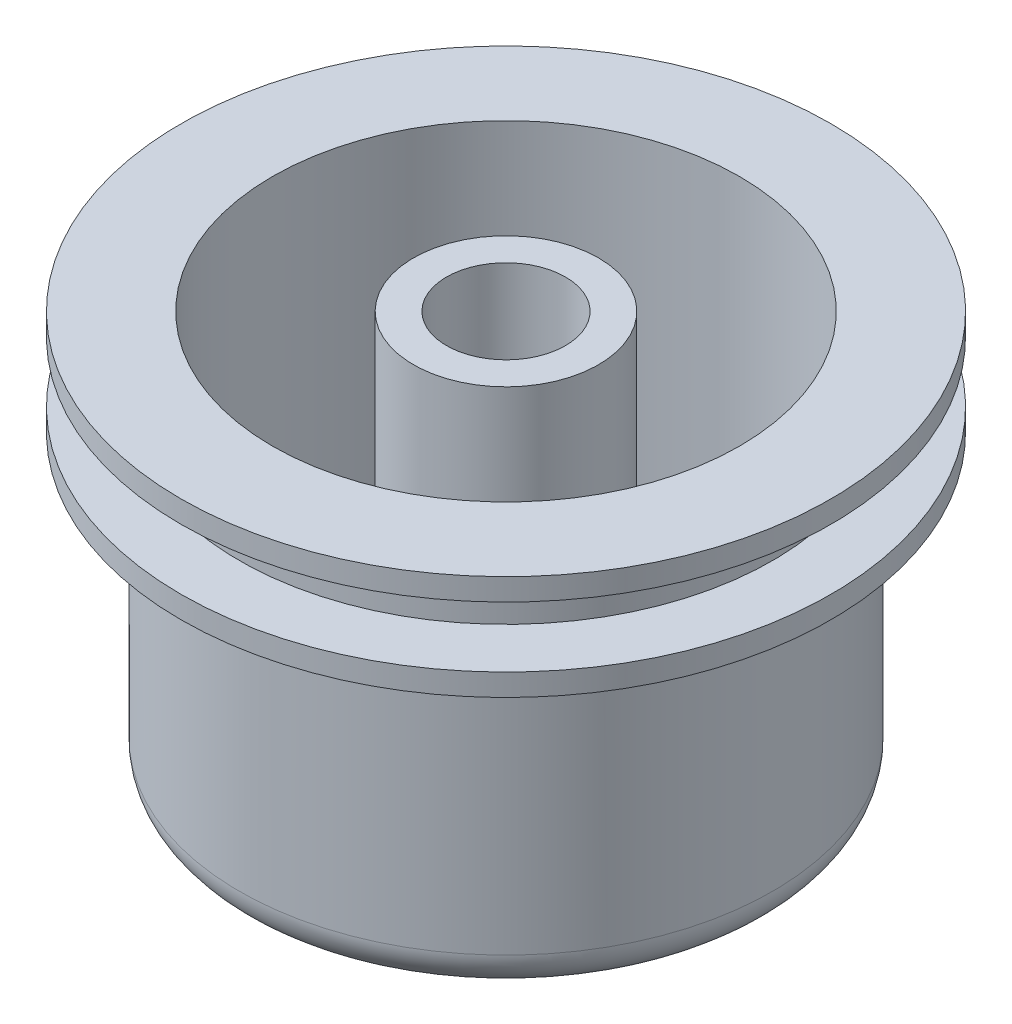
ISO-10303-21;
HEADER;
FILE_DESCRIPTION(('STEP AP214'),'2;1');
FILE_NAME('part.step','',(''),(''),'','','');
FILE_SCHEMA(('AUTOMOTIVE_DESIGN { 1 0 10303 214 1 1 1 1 }'));
ENDSEC;
DATA;
#1=APPLICATION_CONTEXT('core data for automotive mechanical design processes');
#2=APPLICATION_PROTOCOL_DEFINITION('international standard','automotive_design',2000,#1);
#3=PRODUCT_CONTEXT('',#1,'mechanical');
#4=PRODUCT('Part','Part','',(#3));
#5=PRODUCT_RELATED_PRODUCT_CATEGORY('part','',(#4));
#6=PRODUCT_DEFINITION_FORMATION('','',#4);
#7=PRODUCT_DEFINITION_CONTEXT('part definition',#1,'design');
#8=PRODUCT_DEFINITION('design','',#6,#7);
#9=PRODUCT_DEFINITION_SHAPE('','',#8);
#10=(LENGTH_UNIT() NAMED_UNIT(*) SI_UNIT(.MILLI.,.METRE.));
#11=(NAMED_UNIT(*) PLANE_ANGLE_UNIT() SI_UNIT($,.RADIAN.));
#12=(NAMED_UNIT(*) SI_UNIT($,.STERADIAN.) SOLID_ANGLE_UNIT());
#13=UNCERTAINTY_MEASURE_WITH_UNIT(LENGTH_MEASURE(1.E-05),#10,'distance_accuracy_value','');
#14=(GEOMETRIC_REPRESENTATION_CONTEXT(3) GLOBAL_UNCERTAINTY_ASSIGNED_CONTEXT((#13)) GLOBAL_UNIT_ASSIGNED_CONTEXT((#10,
#11,#12)) REPRESENTATION_CONTEXT('',''));
#15=CARTESIAN_POINT('',(0.,0.,0.));
#16=DIRECTION('',(0.,0.,1.));
#17=DIRECTION('',(1.,0.,0.));
#18=AXIS2_PLACEMENT_3D('',#15,#16,#17);
#19=CARTESIAN_POINT('',(0.,19.05508,0.));
#20=DIRECTION('',(0.,-1.,0.));
#21=DIRECTION('',(0.,0.,-1.));
#22=AXIS2_PLACEMENT_3D('',#19,#20,#21);
#23=CYLINDRICAL_SURFACE('',#22,2.7432);
#24=CARTESIAN_POINT('',(0.,18.796,0.));
#25=DIRECTION('',(0.,-1.,0.));
#26=DIRECTION('',(0.,0.,-1.));
#27=AXIS2_PLACEMENT_3D('',#24,#25,#26);
#28=CIRCLE('',#27,2.7432);
#29=CARTESIAN_POINT('',(0.,18.796,-2.7432));
#30=VERTEX_POINT('',#29);
#31=EDGE_CURVE('E231',#30,#30,#28,.T.);
#32=ORIENTED_EDGE('',*,*,#31,.F.);
#33=EDGE_LOOP('',(#32));
#34=FACE_BOUND('',#33,.T.);
#35=CARTESIAN_POINT('',(0.,5.84200000000041,0.));
#36=DIRECTION('',(0.,-1.,0.));
#37=DIRECTION('',(0.,0.,-1.));
#38=AXIS2_PLACEMENT_3D('',#35,#36,#37);
#39=CIRCLE('',#38,2.7432);
#40=CARTESIAN_POINT('',(0.,5.84200000000041,-2.7432));
#41=VERTEX_POINT('',#40);
#42=EDGE_CURVE('E237',#41,#41,#39,.T.);
#43=ORIENTED_EDGE('',*,*,#42,.T.);
#44=EDGE_LOOP('',(#43));
#45=FACE_BOUND('',#44,.T.);
#46=ADVANCED_FACE('F17',(#34,#45),#23,.F.);
#47=CARTESIAN_POINT('',(0.,13.97,0.));
#48=DIRECTION('',(0.,1.,0.));
#49=DIRECTION('',(0.,0.,1.));
#50=AXIS2_PLACEMENT_3D('',#47,#48,#49);
#51=PLANE('',#50);
#52=CARTESIAN_POINT('',(0.,13.97,0.));
#53=DIRECTION('',(0.,-1.,0.));
#54=DIRECTION('',(0.,0.,-1.));
#55=AXIS2_PLACEMENT_3D('',#52,#53,#54);
#56=CIRCLE('',#55,12.2936);
#57=CARTESIAN_POINT('',(0.,13.97,-12.2936));
#58=VERTEX_POINT('',#57);
#59=EDGE_CURVE('E228',#58,#58,#56,.T.);
#60=ORIENTED_EDGE('',*,*,#59,.F.);
#61=EDGE_LOOP('',(#60));
#62=FACE_BOUND('',#61,.T.);
#63=CARTESIAN_POINT('',(0.,13.9700000000011,0.));
#64=DIRECTION('',(0.,1.,0.));
#65=DIRECTION('',(0.,0.,1.));
#66=AXIS2_PLACEMENT_3D('',#63,#64,#65);
#67=CIRCLE('',#66,14.986);
#68=CARTESIAN_POINT('',(0.,13.9700000000011,14.986));
#69=VERTEX_POINT('',#68);
#70=EDGE_CURVE('E234',#69,#69,#67,.T.);
#71=ORIENTED_EDGE('',*,*,#70,.F.);
#72=EDGE_LOOP('',(#71));
#73=FACE_BOUND('',#72,.T.);
#74=ADVANCED_FACE('F114',(#62,#73),#51,.F.);
#75=CARTESIAN_POINT('',(0.,5.842,0.));
#76=DIRECTION('',(0.,1.,0.));
#77=DIRECTION('',(0.,0.,1.));
#78=AXIS2_PLACEMENT_3D('',#75,#76,#77);
#79=PLANE('',#78);
#80=ORIENTED_EDGE('',*,*,#42,.F.);
#81=EDGE_LOOP('',(#80));
#82=FACE_BOUND('',#81,.T.);
#83=CARTESIAN_POINT('',(0.,5.842,0.));
#84=DIRECTION('',(0.,-1.,0.));
#85=DIRECTION('',(0.,0.,-1.));
#86=AXIS2_PLACEMENT_3D('',#83,#84,#85);
#87=CIRCLE('',#86,4.1656);
#88=CARTESIAN_POINT('',(0.,5.842,-4.1656));
#89=VERTEX_POINT('',#88);
#90=EDGE_CURVE('E225',#89,#89,#87,.T.);
#91=ORIENTED_EDGE('',*,*,#90,.T.);
#92=EDGE_LOOP('',(#91));
#93=FACE_BOUND('',#92,.T.);
#94=ADVANCED_FACE('F111',(#82,#93),#79,.F.);
#95=CARTESIAN_POINT('',(0.,13.9143431629979,0.));
#96=DIRECTION('',(0.,1.,0.));
#97=DIRECTION('',(0.,0.,1.));
#98=AXIS2_PLACEMENT_3D('',#95,#96,#97);
#99=CYLINDRICAL_SURFACE('',#98,14.986);
#100=ORIENTED_EDGE('',*,*,#70,.T.);
#101=EDGE_LOOP('',(#100));
#102=FACE_BOUND('',#101,.T.);
#103=CARTESIAN_POINT('',(0.,14.9859999999989,0.));
#104=DIRECTION('',(0.,1.,0.));
#105=DIRECTION('',(0.,0.,1.));
#106=AXIS2_PLACEMENT_3D('',#103,#104,#105);
#107=CIRCLE('',#106,14.986);
#108=CARTESIAN_POINT('',(0.,14.9859999999989,14.986));
#109=VERTEX_POINT('',#108);
#110=EDGE_CURVE('E222',#109,#109,#107,.T.);
#111=ORIENTED_EDGE('',*,*,#110,.F.);
#112=EDGE_LOOP('',(#111));
#113=FACE_BOUND('',#112,.T.);
#114=ADVANCED_FACE('F107',(#102,#113),#99,.T.);
#115=CARTESIAN_POINT('',(0.,18.796,0.));
#116=DIRECTION('',(0.,1.,0.));
#117=DIRECTION('',(0.,0.,1.));
#118=AXIS2_PLACEMENT_3D('',#115,#116,#117);
#119=PLANE('',#118);
#120=ORIENTED_EDGE('',*,*,#31,.T.);
#121=EDGE_LOOP('',(#120));
#122=FACE_BOUND('',#121,.T.);
#123=CARTESIAN_POINT('',(0.,18.796,0.));
#124=DIRECTION('',(0.,-1.,0.));
#125=DIRECTION('',(0.,0.,-1.));
#126=AXIS2_PLACEMENT_3D('',#123,#124,#125);
#127=CIRCLE('',#126,4.2672);
#128=CARTESIAN_POINT('',(0.,18.796,-4.2672));
#129=VERTEX_POINT('',#128);
#130=EDGE_CURVE('E218',#129,#129,#127,.T.);
#131=ORIENTED_EDGE('',*,*,#130,.F.);
#132=EDGE_LOOP('',(#131));
#133=FACE_BOUND('',#132,.T.);
#134=ADVANCED_FACE('F103',(#122,#133),#119,.T.);
#135=CARTESIAN_POINT('',(0.,18.10004,0.));
#136=DIRECTION('',(0.,-1.,0.));
#137=DIRECTION('',(0.,0.,-1.));
#138=AXIS2_PLACEMENT_3D('',#135,#136,#137);
#139=CYLINDRICAL_SURFACE('',#138,12.2936);
#140=CARTESIAN_POINT('',(0.,1.778,0.));
#141=DIRECTION('',(0.,-1.,0.));
#142=DIRECTION('',(-1.,0.,0.));
#143=AXIS2_PLACEMENT_3D('',#140,#141,#142);
#144=CIRCLE('',#143,12.2936000000021);
#145=CARTESIAN_POINT('',(-12.2936000000021,1.778,0.));
#146=VERTEX_POINT('',#145);
#147=EDGE_CURVE('E221',#146,#146,#144,.T.);
#148=ORIENTED_EDGE('',*,*,#147,.F.);
#149=EDGE_LOOP('',(#148));
#150=FACE_BOUND('',#149,.T.);
#151=ORIENTED_EDGE('',*,*,#59,.T.);
#152=EDGE_LOOP('',(#151));
#153=FACE_BOUND('',#152,.T.);
#154=ADVANCED_FACE('F99',(#150,#153),#139,.T.);
#155=CARTESIAN_POINT('',(0.,5.94614,0.));
#156=DIRECTION('',(0.,-1.,0.));
#157=DIRECTION('',(0.,0.,-1.));
#158=AXIS2_PLACEMENT_3D('',#155,#156,#157);
#159=CYLINDRICAL_SURFACE('',#158,4.1656);
#160=ORIENTED_EDGE('',*,*,#90,.F.);
#161=EDGE_LOOP('',(#160));
#162=FACE_BOUND('',#161,.T.);
#163=CARTESIAN_POINT('',(0.,0.635,0.));
#164=DIRECTION('',(0.,-1.,0.));
#165=DIRECTION('',(-0.999785221174219,0.,-0.0207246597467384));
#166=AXIS2_PLACEMENT_3D('',#163,#164,#165);
#167=CIRCLE('',#166,4.16559999999915);
#168=CARTESIAN_POINT('',(-4.16470531732248,0.635,-0.0863306426409961));
#169=VERTEX_POINT('',#168);
#170=EDGE_CURVE('E71',#169,#169,#167,.F.);
#171=ORIENTED_EDGE('',*,*,#170,.F.);
#172=EDGE_LOOP('',(#171));
#173=FACE_BOUND('',#172,.T.);
#174=ADVANCED_FACE('F95',(#162,#173),#159,.F.);
#175=CARTESIAN_POINT('',(0.,14.986,0.));
#176=DIRECTION('',(0.,1.,0.));
#177=DIRECTION('',(0.,0.,1.));
#178=AXIS2_PLACEMENT_3D('',#175,#176,#177);
#179=PLANE('',#178);
#180=CARTESIAN_POINT('',(0.,14.9860000000006,0.));
#181=DIRECTION('',(0.,-1.,0.));
#182=DIRECTION('',(0.,0.,-1.));
#183=AXIS2_PLACEMENT_3D('',#180,#181,#182);
#184=CIRCLE('',#183,12.2936);
#185=CARTESIAN_POINT('',(0.,14.9860000000006,-12.2936));
#186=VERTEX_POINT('',#185);
#187=EDGE_CURVE('E215',#186,#186,#184,.F.);
#188=ORIENTED_EDGE('',*,*,#187,.F.);
#189=EDGE_LOOP('',(#188));
#190=FACE_BOUND('',#189,.T.);
#191=ORIENTED_EDGE('',*,*,#110,.T.);
#192=EDGE_LOOP('',(#191));
#193=FACE_BOUND('',#192,.T.);
#194=ADVANCED_FACE('F91',(#190,#193),#179,.T.);
#195=CARTESIAN_POINT('',(0.,19.0246,0.));
#196=DIRECTION('',(0.,-1.,0.));
#197=DIRECTION('',(0.,0.,-1.));
#198=AXIS2_PLACEMENT_3D('',#195,#196,#197);
#199=CYLINDRICAL_SURFACE('',#198,4.2672);
#200=CARTESIAN_POINT('',(0.,7.36600000000037,0.));
#201=DIRECTION('',(0.,-1.,0.));
#202=DIRECTION('',(0.,0.,-1.));
#203=AXIS2_PLACEMENT_3D('',#200,#201,#202);
#204=CIRCLE('',#203,4.2672);
#205=CARTESIAN_POINT('',(0.,7.36600000000037,-4.2672));
#206=VERTEX_POINT('',#205);
#207=EDGE_CURVE('E58',#206,#206,#204,.T.);
#208=ORIENTED_EDGE('',*,*,#207,.F.);
#209=EDGE_LOOP('',(#208));
#210=FACE_BOUND('',#209,.T.);
#211=ORIENTED_EDGE('',*,*,#130,.T.);
#212=EDGE_LOOP('',(#211));
#213=FACE_BOUND('',#212,.T.);
#214=ADVANCED_FACE('F83',(#210,#213),#199,.T.);
#215=CARTESIAN_POINT('',(0.,1.778,0.));
#216=DIRECTION('',(0.,-1.,0.));
#217=DIRECTION('',(-1.,0.,0.));
#218=AXIS2_PLACEMENT_3D('',#215,#216,#217);
#219=TOROIDAL_SURFACE('',#218,10.515600000002,1.77800000000011);
#220=ORIENTED_EDGE('',*,*,#147,.T.);
#221=EDGE_LOOP('',(#220));
#222=FACE_BOUND('',#221,.T.);
#223=CARTESIAN_POINT('',(0.,-1.11022302462516E-13,0.));
#224=DIRECTION('',(0.,1.,0.));
#225=DIRECTION('',(1.,0.,-2.05735768840494E-13));
#226=AXIS2_PLACEMENT_3D('',#223,#224,#225);
#227=CIRCLE('',#226,10.5156000000018);
#228=CARTESIAN_POINT('',(10.5156000000011,0.,-1.29806100497327E-12));
#229=VERTEX_POINT('',#228);
#230=CARTESIAN_POINT('',(-10.5156000000011,0.,0.));
#231=VERTEX_POINT('',#230);
#232=EDGE_CURVE('E51',#229,#231,#227,.T.);
#233=ORIENTED_EDGE('',*,*,#232,.T.);
#234=CARTESIAN_POINT('',(0.,-1.11022302462516E-13,0.));
#235=DIRECTION('',(0.,1.,0.));
#236=DIRECTION('',(-1.,0.,0.));
#237=AXIS2_PLACEMENT_3D('',#234,#235,#236);
#238=CIRCLE('',#237,10.5156000000018);
#239=EDGE_CURVE('E54',#231,#229,#238,.T.);
#240=ORIENTED_EDGE('',*,*,#239,.T.);
#241=EDGE_LOOP('',(#233,#240));
#242=FACE_BOUND('',#241,.T.);
#243=ADVANCED_FACE('F62',(#222,#242),#219,.T.);
#244=CARTESIAN_POINT('',(0.,0.635,0.));
#245=DIRECTION('',(0.,-1.,0.));
#246=DIRECTION('',(-0.999785221174219,0.,-0.0207246597467384));
#247=AXIS2_PLACEMENT_3D('',#244,#245,#246);
#248=TOROIDAL_SURFACE('',#247,4.80059999999913,0.63499999999998);
#249=ORIENTED_EDGE('',*,*,#170,.T.);
#250=EDGE_LOOP('',(#249));
#251=FACE_BOUND('',#250,.T.);
#252=CARTESIAN_POINT('',(0.,0.,0.));
#253=DIRECTION('',(0.,-1.,0.));
#254=DIRECTION('',(1.,0.,3.93759775316085E-11));
#255=AXIS2_PLACEMENT_3D('',#252,#253,#254);
#256=CIRCLE('',#255,4.8005999999984);
#257=CARTESIAN_POINT('',(4.80059999999904,0.,7.68808682081261E-11));
#258=VERTEX_POINT('',#257);
#259=CARTESIAN_POINT('',(-4.80059999999904,0.,-4.03447647468953E-11));
#260=VERTEX_POINT('',#259);
#261=EDGE_CURVE('E212',#258,#260,#256,.T.);
#262=ORIENTED_EDGE('',*,*,#261,.T.);
#263=CARTESIAN_POINT('',(0.,0.,0.));
#264=DIRECTION('',(0.,-1.,0.));
#265=DIRECTION('',(-1.,0.,0.));
#266=AXIS2_PLACEMENT_3D('',#263,#264,#265);
#267=CIRCLE('',#266,4.8006);
#268=EDGE_CURVE('E63',#260,#258,#267,.T.);
#269=ORIENTED_EDGE('',*,*,#268,.T.);
#270=EDGE_LOOP('',(#262,#269));
#271=FACE_BOUND('',#270,.T.);
#272=ADVANCED_FACE('F82',(#251,#271),#248,.T.);
#273=CARTESIAN_POINT('',(0.,18.10004,0.));
#274=DIRECTION('',(0.,-1.,0.));
#275=DIRECTION('',(0.,0.,-1.));
#276=AXIS2_PLACEMENT_3D('',#273,#274,#275);
#277=CYLINDRICAL_SURFACE('',#276,12.2936);
#278=CARTESIAN_POINT('',(0.,17.78,0.));
#279=DIRECTION('',(0.,-1.,0.));
#280=DIRECTION('',(0.,0.,-1.));
#281=AXIS2_PLACEMENT_3D('',#278,#279,#280);
#282=CIRCLE('',#281,12.2936);
#283=CARTESIAN_POINT('',(0.,17.78,-12.2936));
#284=VERTEX_POINT('',#283);
#285=EDGE_CURVE('E209',#284,#284,#282,.T.);
#286=ORIENTED_EDGE('',*,*,#285,.T.);
#287=EDGE_LOOP('',(#286));
#288=FACE_BOUND('',#287,.T.);
#289=ORIENTED_EDGE('',*,*,#187,.T.);
#290=EDGE_LOOP('',(#289));
#291=FACE_BOUND('',#290,.T.);
#292=ADVANCED_FACE('F310',(#288,#291),#277,.T.);
#293=CARTESIAN_POINT('',(0.,7.366,0.));
#294=DIRECTION('',(0.,1.,0.));
#295=DIRECTION('',(0.,0.,1.));
#296=AXIS2_PLACEMENT_3D('',#293,#294,#295);
#297=PLANE('',#296);
#298=ORIENTED_EDGE('',*,*,#207,.T.);
#299=EDGE_LOOP('',(#298));
#300=FACE_BOUND('',#299,.T.);
#301=CARTESIAN_POINT('',(0.,7.366,0.));
#302=DIRECTION('',(0.,-1.,0.));
#303=DIRECTION('',(0.,0.,-1.));
#304=AXIS2_PLACEMENT_3D('',#301,#302,#303);
#305=CIRCLE('',#304,5.6896);
#306=CARTESIAN_POINT('',(0.,7.366,-5.6896));
#307=VERTEX_POINT('',#306);
#308=EDGE_CURVE('E206',#307,#307,#305,.T.);
#309=ORIENTED_EDGE('',*,*,#308,.F.);
#310=EDGE_LOOP('',(#309));
#311=FACE_BOUND('',#310,.T.);
#312=ADVANCED_FACE('F281',(#300,#311),#297,.T.);
#313=CARTESIAN_POINT('',(0.,0.,0.));
#314=DIRECTION('',(0.,1.,0.));
#315=DIRECTION('',(0.,0.,1.));
#316=AXIS2_PLACEMENT_3D('',#313,#314,#315);
#317=PLANE('',#316);
#318=CARTESIAN_POINT('',(-9.525,0.,0.));
#319=DIRECTION('',(0.,-1.,0.));
#320=DIRECTION('',(0.,0.,-1.));
#321=AXIS2_PLACEMENT_3D('',#318,#319,#320);
#322=CIRCLE('',#321,0.635000000000001);
#323=CARTESIAN_POINT('',(-9.525,0.,-0.635000000000001));
#324=VERTEX_POINT('',#323);
#325=EDGE_CURVE('E200',#324,#324,#322,.F.);
#326=ORIENTED_EDGE('',*,*,#325,.T.);
#327=EDGE_LOOP('',(#326));
#328=FACE_BOUND('',#327,.T.);
#329=CARTESIAN_POINT('',(9.525,0.,0.));
#330=DIRECTION('',(0.,-1.,0.));
#331=DIRECTION('',(0.,0.,-1.));
#332=AXIS2_PLACEMENT_3D('',#329,#330,#331);
#333=CIRCLE('',#332,0.635000000000001);
#334=CARTESIAN_POINT('',(9.525,0.,-0.635000000000001));
#335=VERTEX_POINT('',#334);
#336=EDGE_CURVE('E203',#335,#335,#333,.F.);
#337=ORIENTED_EDGE('',*,*,#336,.T.);
#338=EDGE_LOOP('',(#337));
#339=FACE_BOUND('',#338,.T.);
#340=ORIENTED_EDGE('',*,*,#268,.F.);
#341=ORIENTED_EDGE('',*,*,#261,.F.);
#342=EDGE_LOOP('',(#340,#341));
#343=FACE_BOUND('',#342,.T.);
#344=ORIENTED_EDGE('',*,*,#239,.F.);
#345=ORIENTED_EDGE('',*,*,#232,.F.);
#346=EDGE_LOOP('',(#344,#345));
#347=FACE_BOUND('',#346,.T.);
#348=ADVANCED_FACE('F56',(#328,#339,#343,#347),#317,.F.);
#349=CARTESIAN_POINT('',(0.,17.78,0.));
#350=DIRECTION('',(0.,1.,0.));
#351=DIRECTION('',(0.,0.,1.));
#352=AXIS2_PLACEMENT_3D('',#349,#350,#351);
#353=PLANE('',#352);
#354=ORIENTED_EDGE('',*,*,#285,.F.);
#355=EDGE_LOOP('',(#354));
#356=FACE_BOUND('',#355,.T.);
#357=CARTESIAN_POINT('',(0.,17.7800000000011,0.));
#358=DIRECTION('',(0.,1.,0.));
#359=DIRECTION('',(0.,0.,1.));
#360=AXIS2_PLACEMENT_3D('',#357,#358,#359);
#361=CIRCLE('',#360,14.986);
#362=CARTESIAN_POINT('',(0.,17.7800000000011,14.986));
#363=VERTEX_POINT('',#362);
#364=EDGE_CURVE('E197',#363,#363,#361,.T.);
#365=ORIENTED_EDGE('',*,*,#364,.F.);
#366=EDGE_LOOP('',(#365));
#367=FACE_BOUND('',#366,.T.);
#368=ADVANCED_FACE('F280',(#356,#367),#353,.F.);
#369=CARTESIAN_POINT('',(0.,7.48284,0.));
#370=DIRECTION('',(0.,-1.,0.));
#371=DIRECTION('',(0.,0.,-1.));
#372=AXIS2_PLACEMENT_3D('',#369,#370,#371);
#373=CYLINDRICAL_SURFACE('',#372,5.6896);
#374=ORIENTED_EDGE('',*,*,#308,.T.);
#375=EDGE_LOOP('',(#374));
#376=FACE_BOUND('',#375,.T.);
#377=CARTESIAN_POINT('',(0.,1.52400000000019,0.));
#378=DIRECTION('',(0.,-1.,0.));
#379=DIRECTION('',(0.,0.,-1.));
#380=AXIS2_PLACEMENT_3D('',#377,#378,#379);
#381=CIRCLE('',#380,5.6896);
#382=CARTESIAN_POINT('',(0.,1.52400000000019,-5.6896));
#383=VERTEX_POINT('',#382);
#384=EDGE_CURVE('E194',#383,#383,#381,.T.);
#385=ORIENTED_EDGE('',*,*,#384,.F.);
#386=EDGE_LOOP('',(#385));
#387=FACE_BOUND('',#386,.T.);
#388=ADVANCED_FACE('F327',(#376,#387),#373,.T.);
#389=CARTESIAN_POINT('',(9.525,1.57965683700335,0.));
#390=DIRECTION('',(0.,-1.,0.));
#391=DIRECTION('',(0.,0.,-1.));
#392=AXIS2_PLACEMENT_3D('',#389,#390,#391);
#393=CYLINDRICAL_SURFACE('',#392,0.635000000000001);
#394=CARTESIAN_POINT('',(9.525,1.52400000000003,0.));
#395=DIRECTION('',(0.,-1.,0.));
#396=DIRECTION('',(0.,0.,-1.));
#397=AXIS2_PLACEMENT_3D('',#394,#395,#396);
#398=CIRCLE('',#397,0.635000000000001);
#399=CARTESIAN_POINT('',(9.525,1.52400000000003,-0.635000000000001));
#400=VERTEX_POINT('',#399);
#401=EDGE_CURVE('E191',#400,#400,#398,.T.);
#402=ORIENTED_EDGE('',*,*,#401,.F.);
#403=EDGE_LOOP('',(#402));
#404=FACE_BOUND('',#403,.T.);
#405=ORIENTED_EDGE('',*,*,#336,.F.);
#406=EDGE_LOOP('',(#405));
#407=FACE_BOUND('',#406,.T.);
#408=ADVANCED_FACE('F336',(#404,#407),#393,.F.);
#409=CARTESIAN_POINT('',(-9.525,1.57965683700335,0.));
#410=DIRECTION('',(0.,-1.,0.));
#411=DIRECTION('',(0.,0.,-1.));
#412=AXIS2_PLACEMENT_3D('',#409,#410,#411);
#413=CYLINDRICAL_SURFACE('',#412,0.635000000000001);
#414=CARTESIAN_POINT('',(-9.525,1.52400000000003,0.));
#415=DIRECTION('',(0.,-1.,0.));
#416=DIRECTION('',(0.,0.,-1.));
#417=AXIS2_PLACEMENT_3D('',#414,#415,#416);
#418=CIRCLE('',#417,0.635000000000001);
#419=CARTESIAN_POINT('',(-9.525,1.52400000000003,-0.635000000000001));
#420=VERTEX_POINT('',#419);
#421=EDGE_CURVE('E187',#420,#420,#418,.T.);
#422=ORIENTED_EDGE('',*,*,#421,.F.);
#423=EDGE_LOOP('',(#422));
#424=FACE_BOUND('',#423,.T.);
#425=ORIENTED_EDGE('',*,*,#325,.F.);
#426=EDGE_LOOP('',(#425));
#427=FACE_BOUND('',#426,.T.);
#428=ADVANCED_FACE('F332',(#424,#427),#413,.F.);
#429=CARTESIAN_POINT('',(0.,17.7243431629979,0.));
#430=DIRECTION('',(0.,1.,0.));
#431=DIRECTION('',(0.,0.,1.));
#432=AXIS2_PLACEMENT_3D('',#429,#430,#431);
#433=CYLINDRICAL_SURFACE('',#432,14.986);
#434=ORIENTED_EDGE('',*,*,#364,.T.);
#435=EDGE_LOOP('',(#434));
#436=FACE_BOUND('',#435,.T.);
#437=CARTESIAN_POINT('',(0.,18.7959999999989,0.));
#438=DIRECTION('',(0.,1.,0.));
#439=DIRECTION('',(0.,0.,1.));
#440=AXIS2_PLACEMENT_3D('',#437,#438,#439);
#441=CIRCLE('',#440,14.986);
#442=CARTESIAN_POINT('',(0.,18.7959999999989,14.986));
#443=VERTEX_POINT('',#442);
#444=EDGE_CURVE('E180',#443,#443,#441,.T.);
#445=ORIENTED_EDGE('',*,*,#444,.F.);
#446=EDGE_LOOP('',(#445));
#447=FACE_BOUND('',#446,.T.);
#448=ADVANCED_FACE('F160',(#436,#447),#433,.T.);
#449=CARTESIAN_POINT('',(0.,1.524,0.));
#450=DIRECTION('',(0.,1.,0.));
#451=DIRECTION('',(0.,0.,1.));
#452=AXIS2_PLACEMENT_3D('',#449,#450,#451);
#453=PLANE('',#452);
#454=ORIENTED_EDGE('',*,*,#421,.T.);
#455=EDGE_LOOP('',(#454));
#456=FACE_BOUND('',#455,.T.);
#457=ORIENTED_EDGE('',*,*,#401,.T.);
#458=EDGE_LOOP('',(#457));
#459=FACE_BOUND('',#458,.T.);
#460=ORIENTED_EDGE('',*,*,#384,.T.);
#461=EDGE_LOOP('',(#460));
#462=FACE_BOUND('',#461,.T.);
#463=CARTESIAN_POINT('',(0.,1.524,0.));
#464=DIRECTION('',(0.,-1.,0.));
#465=DIRECTION('',(-1.,0.,0.));
#466=AXIS2_PLACEMENT_3D('',#463,#464,#465);
#467=CIRCLE('',#466,10.5156000000003);
#468=CARTESIAN_POINT('',(10.5156000000002,1.524,-1.29806100497308E-12));
#469=VERTEX_POINT('',#468);
#470=CARTESIAN_POINT('',(-10.5156000000002,1.524,0.));
#471=VERTEX_POINT('',#470);
#472=EDGE_CURVE('E146',#469,#471,#467,.F.);
#473=ORIENTED_EDGE('',*,*,#472,.T.);
#474=CARTESIAN_POINT('',(0.,1.524,0.));
#475=DIRECTION('',(0.,-1.,0.));
#476=DIRECTION('',(1.,0.,-2.05735768840494E-13));
#477=AXIS2_PLACEMENT_3D('',#474,#475,#476);
#478=CIRCLE('',#477,10.5156000000003);
#479=EDGE_CURVE('E36',#471,#469,#478,.F.);
#480=ORIENTED_EDGE('',*,*,#479,.T.);
#481=EDGE_LOOP('',(#473,#480));
#482=FACE_BOUND('',#481,.T.);
#483=ADVANCED_FACE('F151',(#456,#459,#462,#482),#453,.T.);
#484=CARTESIAN_POINT('',(0.,18.796,0.));
#485=DIRECTION('',(0.,1.,0.));
#486=DIRECTION('',(0.,0.,1.));
#487=AXIS2_PLACEMENT_3D('',#484,#485,#486);
#488=PLANE('',#487);
#489=CARTESIAN_POINT('',(0.,18.796,0.));
#490=DIRECTION('',(0.,-1.,0.));
#491=DIRECTION('',(0.,0.,-1.));
#492=AXIS2_PLACEMENT_3D('',#489,#490,#491);
#493=CIRCLE('',#492,10.7696);
#494=CARTESIAN_POINT('',(0.,18.796,-10.7696));
#495=VERTEX_POINT('',#494);
#496=EDGE_CURVE('E28',#495,#495,#493,.T.);
#497=ORIENTED_EDGE('',*,*,#496,.T.);
#498=EDGE_LOOP('',(#497));
#499=FACE_BOUND('',#498,.T.);
#500=ORIENTED_EDGE('',*,*,#444,.T.);
#501=EDGE_LOOP('',(#500));
#502=FACE_BOUND('',#501,.T.);
#503=ADVANCED_FACE('F133',(#499,#502),#488,.T.);
#504=CARTESIAN_POINT('',(0.,1.778,0.));
#505=DIRECTION('',(0.,-1.,0.));
#506=DIRECTION('',(-1.,0.,0.));
#507=AXIS2_PLACEMENT_3D('',#504,#505,#506);
#508=TOROIDAL_SURFACE('',#507,10.5156000000004,0.254000000000003);
#509=ORIENTED_EDGE('',*,*,#472,.F.);
#510=ORIENTED_EDGE('',*,*,#479,.F.);
#511=EDGE_LOOP('',(#509,#510));
#512=FACE_BOUND('',#511,.T.);
#513=CARTESIAN_POINT('',(0.,1.77800000000055,0.));
#514=DIRECTION('',(0.,-1.,0.));
#515=DIRECTION('',(0.,0.,-1.));
#516=AXIS2_PLACEMENT_3D('',#513,#514,#515);
#517=CIRCLE('',#516,10.7696);
#518=CARTESIAN_POINT('',(0.,1.77800000000055,-10.7696));
#519=VERTEX_POINT('',#518);
#520=EDGE_CURVE('E11',#519,#519,#517,.F.);
#521=ORIENTED_EDGE('',*,*,#520,.T.);
#522=EDGE_LOOP('',(#521));
#523=FACE_BOUND('',#522,.T.);
#524=ADVANCED_FACE('F127',(#512,#523),#508,.F.);
#525=CARTESIAN_POINT('',(0.,19.13636,0.));
#526=DIRECTION('',(0.,-1.,0.));
#527=DIRECTION('',(0.,0.,-1.));
#528=AXIS2_PLACEMENT_3D('',#525,#526,#527);
#529=CYLINDRICAL_SURFACE('',#528,10.7696);
#530=ORIENTED_EDGE('',*,*,#520,.F.);
#531=EDGE_LOOP('',(#530));
#532=FACE_BOUND('',#531,.T.);
#533=ORIENTED_EDGE('',*,*,#496,.F.);
#534=EDGE_LOOP('',(#533));
#535=FACE_BOUND('',#534,.T.);
#536=ADVANCED_FACE('F125',(#532,#535),#529,.F.);
#537=CLOSED_SHELL('',(#46,#74,#94,#114,#134,#154,#174,#194,#214,#243,#272,#292,#312,#348,#368,
#388,#408,#428,#448,#483,#503,#524,#536));
#538=MANIFOLD_SOLID_BREP('B1',#537);
#539=ADVANCED_BREP_SHAPE_REPRESENTATION('',(#18,#538),#14);
#540=SHAPE_DEFINITION_REPRESENTATION(#9,#539);
ENDSEC;
END-ISO-10303-21;
